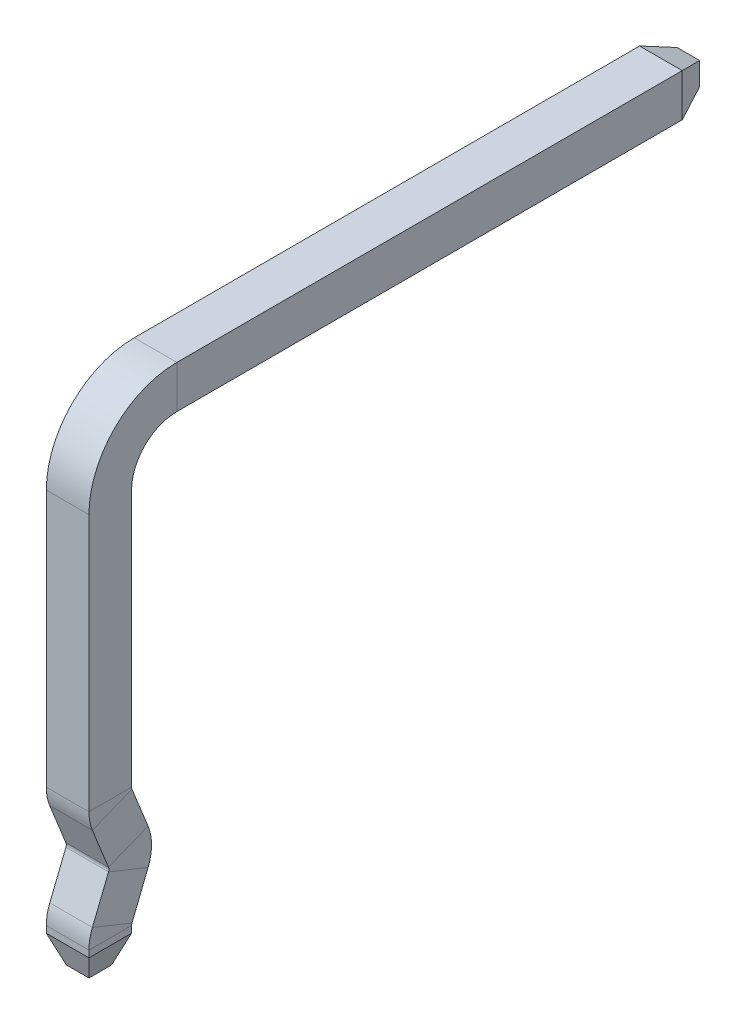
ISO-10303-21;
HEADER;
FILE_DESCRIPTION(('STEP AP214'),'2;1');
FILE_NAME('part.step','',(''),(''),'','','');
FILE_SCHEMA(('AUTOMOTIVE_DESIGN { 1 0 10303 214 1 1 1 1 }'));
ENDSEC;
DATA;
#1=APPLICATION_CONTEXT('core data for automotive mechanical design processes');
#2=APPLICATION_PROTOCOL_DEFINITION('international standard','automotive_design',2000,#1);
#3=PRODUCT_CONTEXT('',#1,'mechanical');
#4=PRODUCT('Part','Part','',(#3));
#5=PRODUCT_RELATED_PRODUCT_CATEGORY('part','',(#4));
#6=PRODUCT_DEFINITION_FORMATION('','',#4);
#7=PRODUCT_DEFINITION_CONTEXT('part definition',#1,'design');
#8=PRODUCT_DEFINITION('design','',#6,#7);
#9=PRODUCT_DEFINITION_SHAPE('','',#8);
#10=(LENGTH_UNIT() NAMED_UNIT(*) SI_UNIT(.MILLI.,.METRE.));
#11=(NAMED_UNIT(*) PLANE_ANGLE_UNIT() SI_UNIT($,.RADIAN.));
#12=(NAMED_UNIT(*) SI_UNIT($,.STERADIAN.) SOLID_ANGLE_UNIT());
#13=UNCERTAINTY_MEASURE_WITH_UNIT(LENGTH_MEASURE(1.E-05),#10,'distance_accuracy_value','');
#14=(GEOMETRIC_REPRESENTATION_CONTEXT(3) GLOBAL_UNCERTAINTY_ASSIGNED_CONTEXT((#13)) GLOBAL_UNIT_ASSIGNED_CONTEXT((#10,
#11,#12)) REPRESENTATION_CONTEXT('',''));
#15=CARTESIAN_POINT('',(0.,0.,0.));
#16=DIRECTION('',(0.,0.,1.));
#17=DIRECTION('',(1.,0.,0.));
#18=AXIS2_PLACEMENT_3D('',#15,#16,#17);
#19=CARTESIAN_POINT('',(5.32,-2.987878387082,3.13));
#20=DIRECTION('',(0.,-0.342020143325932,-0.939692620785813));
#21=DIRECTION('',(0.,-0.939692620785813,0.342020143325932));
#22=AXIS2_PLACEMENT_3D('',#19,#20,#21);
#23=PLANE('',#22);
#24=DIRECTION('',(0.323615577118036,0.889126490716097,-0.323615577118036));
#25=VECTOR('',#24,1.);
#26=CARTESIAN_POINT('',(5.32,-2.987878387082,3.13));
#27=LINE('',#26,#25);
#28=CARTESIAN_POINT('',(5.17,-3.4,3.28));
#29=VERTEX_POINT('',#28);
#30=CARTESIAN_POINT('',(5.32,-2.987878387082,3.13));
#31=VERTEX_POINT('',#30);
#32=EDGE_CURVE('E27',#29,#31,#27,.T.);
#33=ORIENTED_EDGE('',*,*,#32,.F.);
#34=DIRECTION('',(1.,0.,0.));
#35=VECTOR('',#34,1.);
#36=CARTESIAN_POINT('',(5.32,-3.4,3.28));
#37=LINE('',#36,#35);
#38=CARTESIAN_POINT('',(4.83,-3.4,3.28));
#39=VERTEX_POINT('',#38);
#40=EDGE_CURVE('E338',#39,#29,#37,.T.);
#41=ORIENTED_EDGE('',*,*,#40,.F.);
#42=DIRECTION('',(0.323615577118036,-0.889126490716097,0.323615577118036));
#43=VECTOR('',#42,1.);
#44=CARTESIAN_POINT('',(4.68,-2.987878387082,3.13));
#45=LINE('',#44,#43);
#46=CARTESIAN_POINT('',(4.68,-2.987878387082,3.13));
#47=VERTEX_POINT('',#46);
#48=EDGE_CURVE('E11',#47,#39,#45,.T.);
#49=ORIENTED_EDGE('',*,*,#48,.F.);
#50=DIRECTION('',(1.,0.,0.));
#51=VECTOR('',#50,1.);
#52=CARTESIAN_POINT('',(4.68,-2.987878387082,3.13));
#53=LINE('',#52,#51);
#54=EDGE_CURVE('E296',#47,#31,#53,.T.);
#55=ORIENTED_EDGE('',*,*,#54,.T.);
#56=EDGE_LOOP('',(#33,#41,#49,#55));
#57=FACE_BOUND('',#56,.T.);
#58=ADVANCED_FACE('F16',(#57),#23,.T.);
#59=CARTESIAN_POINT('',(4.68,-2.987878387082,3.13));
#60=DIRECTION('',(-0.939692620785813,-0.342020143325932,0.));
#61=DIRECTION('',(-0.342020143325932,0.939692620785813,0.));
#62=AXIS2_PLACEMENT_3D('',#59,#60,#61);
#63=PLANE('',#62);
#64=ORIENTED_EDGE('',*,*,#48,.T.);
#65=DIRECTION('',(0.,0.,-1.));
#66=VECTOR('',#65,1.);
#67=CARTESIAN_POINT('',(4.83,-3.4,3.13));
#68=LINE('',#67,#66);
#69=CARTESIAN_POINT('',(4.83,-3.4,3.62));
#70=VERTEX_POINT('',#69);
#71=EDGE_CURVE('E326',#70,#39,#68,.T.);
#72=ORIENTED_EDGE('',*,*,#71,.F.);
#73=DIRECTION('',(0.323615577118036,-0.889126490716097,-0.323615577118036));
#74=VECTOR('',#73,1.);
#75=CARTESIAN_POINT('',(4.747025306722,-3.172028903833,3.702974693278));
#76=LINE('',#75,#74);
#77=CARTESIAN_POINT('',(4.68,-2.987878387082,3.77));
#78=VERTEX_POINT('',#77);
#79=EDGE_CURVE('E342',#78,#70,#76,.T.);
#80=ORIENTED_EDGE('',*,*,#79,.F.);
#81=DIRECTION('',(0.,0.,-1.));
#82=VECTOR('',#81,1.);
#83=CARTESIAN_POINT('',(4.68,-2.987878387082,3.77));
#84=LINE('',#83,#82);
#85=EDGE_CURVE('E313',#78,#47,#84,.T.);
#86=ORIENTED_EDGE('',*,*,#85,.T.);
#87=EDGE_LOOP('',(#64,#72,#80,#86));
#88=FACE_BOUND('',#87,.T.);
#89=ADVANCED_FACE('F742',(#88),#63,.T.);
#90=CARTESIAN_POINT('',(5.32,-2.987878387082,3.77));
#91=DIRECTION('',(0.939692620785813,-0.342020143325932,0.));
#92=DIRECTION('',(0.,0.,-1.));
#93=AXIS2_PLACEMENT_3D('',#90,#91,#92);
#94=PLANE('',#93);
#95=ORIENTED_EDGE('',*,*,#32,.T.);
#96=DIRECTION('',(0.,0.,1.));
#97=VECTOR('',#96,1.);
#98=CARTESIAN_POINT('',(5.32,-2.987878387082,3.13));
#99=LINE('',#98,#97);
#100=CARTESIAN_POINT('',(5.32,-2.987878387082,3.77));
#101=VERTEX_POINT('',#100);
#102=EDGE_CURVE('E357',#31,#101,#99,.T.);
#103=ORIENTED_EDGE('',*,*,#102,.T.);
#104=DIRECTION('',(0.323615577118036,0.889126490716097,0.323615577118036));
#105=VECTOR('',#104,1.);
#106=CARTESIAN_POINT('',(5.32,-2.987878387082,3.77));
#107=LINE('',#106,#105);
#108=CARTESIAN_POINT('',(5.17,-3.4,3.62));
#109=VERTEX_POINT('',#108);
#110=EDGE_CURVE('E364',#109,#101,#107,.T.);
#111=ORIENTED_EDGE('',*,*,#110,.F.);
#112=DIRECTION('',(0.,0.,1.));
#113=VECTOR('',#112,1.);
#114=CARTESIAN_POINT('',(5.17,-3.4,3.77));
#115=LINE('',#114,#113);
#116=EDGE_CURVE('E327',#29,#109,#115,.T.);
#117=ORIENTED_EDGE('',*,*,#116,.F.);
#118=EDGE_LOOP('',(#95,#103,#111,#117));
#119=FACE_BOUND('',#118,.T.);
#120=ADVANCED_FACE('F747',(#119),#94,.T.);
#121=CARTESIAN_POINT('',(4.68,-2.987878387082,3.77));
#122=DIRECTION('',(0.,-0.342020143325932,0.939692620785813));
#123=DIRECTION('',(-1.,0.,0.));
#124=AXIS2_PLACEMENT_3D('',#121,#122,#123);
#125=PLANE('',#124);
#126=ORIENTED_EDGE('',*,*,#79,.T.);
#127=DIRECTION('',(-1.,0.,0.));
#128=VECTOR('',#127,1.);
#129=CARTESIAN_POINT('',(4.68,-3.4,3.62));
#130=LINE('',#129,#128);
#131=EDGE_CURVE('E322',#109,#70,#130,.T.);
#132=ORIENTED_EDGE('',*,*,#131,.F.);
#133=ORIENTED_EDGE('',*,*,#110,.T.);
#134=DIRECTION('',(-1.,0.,0.));
#135=VECTOR('',#134,1.);
#136=CARTESIAN_POINT('',(5.32,-2.987878387082,3.77));
#137=LINE('',#136,#135);
#138=EDGE_CURVE('E212',#101,#78,#137,.T.);
#139=ORIENTED_EDGE('',*,*,#138,.T.);
#140=EDGE_LOOP('',(#126,#132,#133,#139));
#141=FACE_BOUND('',#140,.T.);
#142=ADVANCED_FACE('F883',(#141),#125,.T.);
#143=CARTESIAN_POINT('',(0.,-3.4,-0.325));
#144=DIRECTION('',(0.,1.,0.));
#145=DIRECTION('',(0.,0.,-1.));
#146=AXIS2_PLACEMENT_3D('',#143,#144,#145);
#147=PLANE('',#146);
#148=ORIENTED_EDGE('',*,*,#116,.T.);
#149=ORIENTED_EDGE('',*,*,#131,.T.);
#150=ORIENTED_EDGE('',*,*,#71,.T.);
#151=ORIENTED_EDGE('',*,*,#40,.T.);
#152=EDGE_LOOP('',(#148,#149,#150,#151));
#153=FACE_BOUND('',#152,.T.);
#154=ADVANCED_FACE('F878',(#153),#147,.F.);
#155=CARTESIAN_POINT('',(5.32,2.775,3.77));
#156=DIRECTION('',(0.,0.,1.));
#157=DIRECTION('',(1.,0.,0.));
#158=AXIS2_PLACEMENT_3D('',#155,#156,#157);
#159=PLANE('',#158);
#160=DIRECTION('',(0.,-1.,0.));
#161=VECTOR('',#160,1.);
#162=CARTESIAN_POINT('',(4.68,2.775,3.77));
#163=LINE('',#162,#161);
#164=CARTESIAN_POINT('',(4.68,2.775,3.77));
#165=VERTEX_POINT('',#164);
#166=CARTESIAN_POINT('',(4.68,-1.087878387082,3.77));
#167=VERTEX_POINT('',#166);
#168=EDGE_CURVE('E402',#165,#167,#163,.T.);
#169=ORIENTED_EDGE('',*,*,#168,.T.);
#170=DIRECTION('',(-1.,0.,0.));
#171=VECTOR('',#170,1.);
#172=CARTESIAN_POINT('',(5.32,-1.087878387082,3.77));
#173=LINE('',#172,#171);
#174=CARTESIAN_POINT('',(5.32,-1.087878387082,3.77));
#175=VERTEX_POINT('',#174);
#176=EDGE_CURVE('E290',#175,#167,#173,.T.);
#177=ORIENTED_EDGE('',*,*,#176,.F.);
#178=DIRECTION('',(0.,-1.,0.));
#179=VECTOR('',#178,1.);
#180=CARTESIAN_POINT('',(5.32,2.775,3.77));
#181=LINE('',#180,#179);
#182=CARTESIAN_POINT('',(5.32,2.775,3.77));
#183=VERTEX_POINT('',#182);
#184=EDGE_CURVE('E306',#183,#175,#181,.T.);
#185=ORIENTED_EDGE('',*,*,#184,.F.);
#186=DIRECTION('',(1.,0.,0.));
#187=VECTOR('',#186,1.);
#188=CARTESIAN_POINT('',(4.68,2.775,3.77));
#189=LINE('',#188,#187);
#190=EDGE_CURVE('E232',#165,#183,#189,.T.);
#191=ORIENTED_EDGE('',*,*,#190,.F.);
#192=EDGE_LOOP('',(#169,#177,#185,#191));
#193=FACE_BOUND('',#192,.T.);
#194=ADVANCED_FACE('F650',(#193),#159,.T.);
#195=CARTESIAN_POINT('',(4.68,2.775,3.13));
#196=DIRECTION('',(0.,0.,-1.));
#197=DIRECTION('',(0.,-1.,0.));
#198=AXIS2_PLACEMENT_3D('',#195,#196,#197);
#199=PLANE('',#198);
#200=DIRECTION('',(1.,0.,0.));
#201=VECTOR('',#200,1.);
#202=CARTESIAN_POINT('',(4.68,-1.087878387082,3.13));
#203=LINE('',#202,#201);
#204=CARTESIAN_POINT('',(4.68,-1.087878387082,3.13));
#205=VERTEX_POINT('',#204);
#206=CARTESIAN_POINT('',(5.32,-1.087878387082,3.13));
#207=VERTEX_POINT('',#206);
#208=EDGE_CURVE('E307',#205,#207,#203,.T.);
#209=ORIENTED_EDGE('',*,*,#208,.F.);
#210=DIRECTION('',(0.,-1.,0.));
#211=VECTOR('',#210,1.);
#212=CARTESIAN_POINT('',(4.68,2.775,3.13));
#213=LINE('',#212,#211);
#214=CARTESIAN_POINT('',(4.68,2.775,3.13));
#215=VERTEX_POINT('',#214);
#216=EDGE_CURVE('E371',#215,#205,#213,.T.);
#217=ORIENTED_EDGE('',*,*,#216,.F.);
#218=DIRECTION('',(-1.,0.,0.));
#219=VECTOR('',#218,1.);
#220=CARTESIAN_POINT('',(5.32,2.775,3.13));
#221=LINE('',#220,#219);
#222=CARTESIAN_POINT('',(5.32,2.775,3.13));
#223=VERTEX_POINT('',#222);
#224=EDGE_CURVE('E221',#223,#215,#221,.T.);
#225=ORIENTED_EDGE('',*,*,#224,.F.);
#226=DIRECTION('',(0.,-1.,0.));
#227=VECTOR('',#226,1.);
#228=CARTESIAN_POINT('',(5.32,2.775,3.13));
#229=LINE('',#228,#227);
#230=EDGE_CURVE('E233',#223,#207,#229,.T.);
#231=ORIENTED_EDGE('',*,*,#230,.T.);
#232=EDGE_LOOP('',(#209,#217,#225,#231));
#233=FACE_BOUND('',#232,.T.);
#234=ADVANCED_FACE('F645',(#233),#199,.T.);
#235=CARTESIAN_POINT('',(5.32,-1.087878387082,3.13));
#236=DIRECTION('',(1.,0.,0.));
#237=DIRECTION('',(0.,1.,0.));
#238=AXIS2_PLACEMENT_3D('',#235,#236,#237);
#239=PLANE('',#238);
#240=CARTESIAN_POINT('',(5.32,-1.087878387082,3.05));
#241=DIRECTION('',(1.,0.,0.));
#242=DIRECTION('',(0.,0.,1.));
#243=AXIS2_PLACEMENT_3D('',#240,#241,#242);
#244=CIRCLE('',#243,0.72);
#245=CARTESIAN_POINT('',(5.32,-1.356834363362,3.717879242695));
#246=VERTEX_POINT('',#245);
#247=EDGE_CURVE('E286',#175,#246,#244,.T.);
#248=ORIENTED_EDGE('',*,*,#247,.T.);
#249=DIRECTION('',(0.,-0.373549967055956,0.927610059298892));
#250=VECTOR('',#249,1.);
#251=CARTESIAN_POINT('',(5.32,-1.117762384446,3.124208804744));
#252=LINE('',#251,#250);
#253=CARTESIAN_POINT('',(5.32,-1.117762384446,3.124208804744));
#254=VERTEX_POINT('',#253);
#255=EDGE_CURVE('E267',#254,#246,#252,.T.);
#256=ORIENTED_EDGE('',*,*,#255,.F.);
#257=CARTESIAN_POINT('',(5.32,-1.087878387082,3.05));
#258=DIRECTION('',(1.,0.,0.));
#259=DIRECTION('',(0.,0.,1.));
#260=AXIS2_PLACEMENT_3D('',#257,#258,#259);
#261=CIRCLE('',#260,0.08);
#262=EDGE_CURVE('E311',#207,#254,#261,.T.);
#263=ORIENTED_EDGE('',*,*,#262,.F.);
#264=DIRECTION('',(0.,0.,1.));
#265=VECTOR('',#264,1.);
#266=CARTESIAN_POINT('',(5.32,-1.087878387082,3.13));
#267=LINE('',#266,#265);
#268=EDGE_CURVE('E302',#207,#175,#267,.T.);
#269=ORIENTED_EDGE('',*,*,#268,.T.);
#270=EDGE_LOOP('',(#248,#256,#263,#269));
#271=FACE_BOUND('',#270,.T.);
#272=ADVANCED_FACE('F573',(#271),#239,.T.);
#273=CARTESIAN_POINT('',(4.68,-1.087878387082,3.05));
#274=DIRECTION('',(1.,0.,0.));
#275=DIRECTION('',(0.,0.,-1.));
#276=AXIS2_PLACEMENT_3D('',#273,#274,#275);
#277=CYLINDRICAL_SURFACE('',#276,0.72);
#278=CARTESIAN_POINT('',(4.68,-1.087878387082,3.05));
#279=DIRECTION('',(1.,0.,0.));
#280=DIRECTION('',(0.,0.,1.));
#281=AXIS2_PLACEMENT_3D('',#278,#279,#280);
#282=CIRCLE('',#281,0.72);
#283=CARTESIAN_POINT('',(4.68,-1.356834363362,3.717879242695));
#284=VERTEX_POINT('',#283);
#285=EDGE_CURVE('E291',#167,#284,#282,.T.);
#286=ORIENTED_EDGE('',*,*,#285,.T.);
#287=DIRECTION('',(-1.,0.,0.));
#288=VECTOR('',#287,1.);
#289=CARTESIAN_POINT('',(5.32,-1.356834363362,3.717879242695));
#290=LINE('',#289,#288);
#291=EDGE_CURVE('E255',#246,#284,#290,.T.);
#292=ORIENTED_EDGE('',*,*,#291,.F.);
#293=ORIENTED_EDGE('',*,*,#247,.F.);
#294=ORIENTED_EDGE('',*,*,#176,.T.);
#295=EDGE_LOOP('',(#286,#292,#293,#294));
#296=FACE_BOUND('',#295,.T.);
#297=ADVANCED_FACE('F661',(#296),#277,.T.);
#298=CARTESIAN_POINT('',(4.68,-1.087878387082,3.77));
#299=DIRECTION('',(-1.,0.,0.));
#300=DIRECTION('',(0.,0.,1.));
#301=AXIS2_PLACEMENT_3D('',#298,#299,#300);
#302=PLANE('',#301);
#303=CARTESIAN_POINT('',(4.68,-1.087878387082,3.05));
#304=DIRECTION('',(1.,0.,0.));
#305=DIRECTION('',(0.,0.,1.));
#306=AXIS2_PLACEMENT_3D('',#303,#304,#305);
#307=CIRCLE('',#306,0.08);
#308=CARTESIAN_POINT('',(4.68,-1.117762384446,3.124208804744));
#309=VERTEX_POINT('',#308);
#310=EDGE_CURVE('E312',#205,#309,#307,.T.);
#311=ORIENTED_EDGE('',*,*,#310,.T.);
#312=DIRECTION('',(0.,0.373549967055956,-0.927610059298892));
#313=VECTOR('',#312,1.);
#314=CARTESIAN_POINT('',(4.68,-1.356834363362,3.717879242695));
#315=LINE('',#314,#313);
#316=EDGE_CURVE('E256',#284,#309,#315,.T.);
#317=ORIENTED_EDGE('',*,*,#316,.F.);
#318=ORIENTED_EDGE('',*,*,#285,.F.);
#319=DIRECTION('',(0.,0.,-1.));
#320=VECTOR('',#319,1.);
#321=CARTESIAN_POINT('',(4.68,-1.087878387082,3.77));
#322=LINE('',#321,#320);
#323=EDGE_CURVE('E407',#167,#205,#322,.T.);
#324=ORIENTED_EDGE('',*,*,#323,.T.);
#325=EDGE_LOOP('',(#311,#317,#318,#324));
#326=FACE_BOUND('',#325,.T.);
#327=ADVANCED_FACE('F656',(#326),#302,.T.);
#328=CARTESIAN_POINT('',(4.68,-1.087878387082,3.05));
#329=DIRECTION('',(1.,0.,0.));
#330=DIRECTION('',(0.,0.,-1.));
#331=AXIS2_PLACEMENT_3D('',#328,#329,#330);
#332=CYLINDRICAL_SURFACE('',#331,0.08);
#333=DIRECTION('',(1.,0.,0.));
#334=VECTOR('',#333,1.);
#335=CARTESIAN_POINT('',(4.68,-1.117762384446,3.124208804744));
#336=LINE('',#335,#334);
#337=EDGE_CURVE('E295',#309,#254,#336,.T.);
#338=ORIENTED_EDGE('',*,*,#337,.F.);
#339=ORIENTED_EDGE('',*,*,#310,.F.);
#340=ORIENTED_EDGE('',*,*,#208,.T.);
#341=ORIENTED_EDGE('',*,*,#262,.T.);
#342=EDGE_LOOP('',(#338,#339,#340,#341));
#343=FACE_BOUND('',#342,.T.);
#344=ADVANCED_FACE('F568',(#343),#332,.F.);
#345=CARTESIAN_POINT('',(5.32,-1.117762384446,3.124208804744));
#346=DIRECTION('',(1.,0.,0.));
#347=DIRECTION('',(0.,1.,0.));
#348=AXIS2_PLACEMENT_3D('',#345,#346,#347);
#349=PLANE('',#348);
#350=DIRECTION('',(0.,-0.927610059298892,-0.373549967055956));
#351=VECTOR('',#350,1.);
#352=CARTESIAN_POINT('',(5.32,-1.356834363362,3.717879242695));
#353=LINE('',#352,#351);
#354=CARTESIAN_POINT('',(5.32,-1.957994389717,3.475791195256));
#355=VERTEX_POINT('',#354);
#356=EDGE_CURVE('E252',#246,#355,#353,.T.);
#357=ORIENTED_EDGE('',*,*,#356,.T.);
#358=DIRECTION('',(0.,-0.373549967055956,0.927610059298892));
#359=VECTOR('',#358,1.);
#360=CARTESIAN_POINT('',(5.32,-1.718922410801,2.882120757305));
#361=LINE('',#360,#359);
#362=CARTESIAN_POINT('',(5.32,-1.718922410801,2.882120757305));
#363=VERTEX_POINT('',#362);
#364=EDGE_CURVE('E251',#363,#355,#361,.T.);
#365=ORIENTED_EDGE('',*,*,#364,.F.);
#366=DIRECTION('',(0.,-0.927610059298892,-0.373549967055956));
#367=VECTOR('',#366,1.);
#368=CARTESIAN_POINT('',(5.32,-1.117762384446,3.124208804744));
#369=LINE('',#368,#367);
#370=EDGE_CURVE('E281',#254,#363,#369,.T.);
#371=ORIENTED_EDGE('',*,*,#370,.F.);
#372=ORIENTED_EDGE('',*,*,#255,.T.);
#373=EDGE_LOOP('',(#357,#365,#371,#372));
#374=FACE_BOUND('',#373,.T.);
#375=ADVANCED_FACE('F576',(#374),#349,.T.);
#376=CARTESIAN_POINT('',(5.32,-1.356834363362,3.717879242695));
#377=DIRECTION('',(0.,-0.373549967055956,0.927610059298892));
#378=DIRECTION('',(-1.,0.,0.));
#379=AXIS2_PLACEMENT_3D('',#376,#377,#378);
#380=PLANE('',#379);
#381=DIRECTION('',(0.,-0.927610059298892,-0.373549967055956));
#382=VECTOR('',#381,1.);
#383=CARTESIAN_POINT('',(4.68,-1.356834363362,3.717879242695));
#384=LINE('',#383,#382);
#385=CARTESIAN_POINT('',(4.68,-1.957994389717,3.475791195256));
#386=VERTEX_POINT('',#385);
#387=EDGE_CURVE('E270',#284,#386,#384,.T.);
#388=ORIENTED_EDGE('',*,*,#387,.T.);
#389=DIRECTION('',(-1.,0.,0.));
#390=VECTOR('',#389,1.);
#391=CARTESIAN_POINT('',(5.32,-1.957994389717,3.475791195256));
#392=LINE('',#391,#390);
#393=EDGE_CURVE('E194',#355,#386,#392,.T.);
#394=ORIENTED_EDGE('',*,*,#393,.F.);
#395=ORIENTED_EDGE('',*,*,#356,.F.);
#396=ORIENTED_EDGE('',*,*,#291,.T.);
#397=EDGE_LOOP('',(#388,#394,#395,#396));
#398=FACE_BOUND('',#397,.T.);
#399=ADVANCED_FACE('F594',(#398),#380,.T.);
#400=CARTESIAN_POINT('',(4.68,-1.356834363362,3.717879242695));
#401=DIRECTION('',(-1.,0.,0.));
#402=DIRECTION('',(0.,0.,1.));
#403=AXIS2_PLACEMENT_3D('',#400,#401,#402);
#404=PLANE('',#403);
#405=DIRECTION('',(0.,-0.927610059298892,-0.373549967055956));
#406=VECTOR('',#405,1.);
#407=CARTESIAN_POINT('',(4.68,-1.117762384446,3.124208804744));
#408=LINE('',#407,#406);
#409=CARTESIAN_POINT('',(4.68,-1.718922410801,2.882120757305));
#410=VERTEX_POINT('',#409);
#411=EDGE_CURVE('E363',#309,#410,#408,.T.);
#412=ORIENTED_EDGE('',*,*,#411,.T.);
#413=DIRECTION('',(0.,0.373549967055956,-0.927610059298892));
#414=VECTOR('',#413,1.);
#415=CARTESIAN_POINT('',(4.68,-1.957994389717,3.475791195256));
#416=LINE('',#415,#414);
#417=EDGE_CURVE('E195',#386,#410,#416,.T.);
#418=ORIENTED_EDGE('',*,*,#417,.F.);
#419=ORIENTED_EDGE('',*,*,#387,.F.);
#420=ORIENTED_EDGE('',*,*,#316,.T.);
#421=EDGE_LOOP('',(#412,#418,#419,#420));
#422=FACE_BOUND('',#421,.T.);
#423=ADVANCED_FACE('F582',(#422),#404,.T.);
#424=CARTESIAN_POINT('',(4.68,-1.117762384446,3.124208804744));
#425=DIRECTION('',(0.,0.373549967055956,-0.927610059298892));
#426=DIRECTION('',(-1.,0.,0.));
#427=AXIS2_PLACEMENT_3D('',#424,#425,#426);
#428=PLANE('',#427);
#429=DIRECTION('',(1.,0.,0.));
#430=VECTOR('',#429,1.);
#431=CARTESIAN_POINT('',(4.68,-1.718922410801,2.882120757305));
#432=LINE('',#431,#430);
#433=EDGE_CURVE('E228',#410,#363,#432,.T.);
#434=ORIENTED_EDGE('',*,*,#433,.F.);
#435=ORIENTED_EDGE('',*,*,#411,.F.);
#436=ORIENTED_EDGE('',*,*,#337,.T.);
#437=ORIENTED_EDGE('',*,*,#370,.T.);
#438=EDGE_LOOP('',(#434,#435,#436,#437));
#439=FACE_BOUND('',#438,.T.);
#440=ADVANCED_FACE('F579',(#439),#428,.T.);
#441=CARTESIAN_POINT('',(5.32,-1.718922410801,2.882120757305));
#442=DIRECTION('',(1.,0.,0.));
#443=DIRECTION('',(0.,1.,0.));
#444=AXIS2_PLACEMENT_3D('',#441,#442,#443);
#445=PLANE('',#444);
#446=CARTESIAN_POINT('',(5.32,-1.987878387082,3.55));
#447=DIRECTION('',(-1.,0.,0.));
#448=DIRECTION('',(0.,0.373549967055956,-0.927610059298892));
#449=AXIS2_PLACEMENT_3D('',#446,#447,#448);
#450=CIRCLE('',#449,0.08);
#451=CARTESIAN_POINT('',(5.32,-2.017762384446,3.475791195256));
#452=VERTEX_POINT('',#451);
#453=EDGE_CURVE('E190',#355,#452,#450,.T.);
#454=ORIENTED_EDGE('',*,*,#453,.T.);
#455=DIRECTION('',(0.,0.373549967055956,0.927610059298892));
#456=VECTOR('',#455,1.);
#457=CARTESIAN_POINT('',(5.32,-2.256834363362,2.882120757305));
#458=LINE('',#457,#456);
#459=CARTESIAN_POINT('',(5.32,-2.256834363362,2.882120757305));
#460=VERTEX_POINT('',#459);
#461=EDGE_CURVE('E133',#460,#452,#458,.T.);
#462=ORIENTED_EDGE('',*,*,#461,.F.);
#463=CARTESIAN_POINT('',(5.32,-1.987878387082,3.55));
#464=DIRECTION('',(-1.,0.,0.));
#465=DIRECTION('',(0.,0.373549967055956,-0.927610059298892));
#466=AXIS2_PLACEMENT_3D('',#463,#464,#465);
#467=CIRCLE('',#466,0.72);
#468=EDGE_CURVE('E317',#363,#460,#467,.T.);
#469=ORIENTED_EDGE('',*,*,#468,.F.);
#470=ORIENTED_EDGE('',*,*,#364,.T.);
#471=EDGE_LOOP('',(#454,#462,#469,#470));
#472=FACE_BOUND('',#471,.T.);
#473=ADVANCED_FACE('F684',(#472),#445,.T.);
#474=CARTESIAN_POINT('',(4.68,-1.987878387082,3.55));
#475=DIRECTION('',(-1.,0.,0.));
#476=DIRECTION('',(0.,0.,1.));
#477=AXIS2_PLACEMENT_3D('',#474,#475,#476);
#478=CYLINDRICAL_SURFACE('',#477,0.08);
#479=CARTESIAN_POINT('',(4.68,-1.987878387082,3.55));
#480=DIRECTION('',(-1.,0.,0.));
#481=DIRECTION('',(0.,0.373549967055956,-0.927610059298892));
#482=AXIS2_PLACEMENT_3D('',#479,#480,#481);
#483=CIRCLE('',#482,0.08);
#484=CARTESIAN_POINT('',(4.68,-2.017762384446,3.475791195256));
#485=VERTEX_POINT('',#484);
#486=EDGE_CURVE('E320',#386,#485,#483,.T.);
#487=ORIENTED_EDGE('',*,*,#486,.T.);
#488=DIRECTION('',(-1.,0.,0.));
#489=VECTOR('',#488,1.);
#490=CARTESIAN_POINT('',(5.32,-2.017762384446,3.475791195256));
#491=LINE('',#490,#489);
#492=EDGE_CURVE('E139',#452,#485,#491,.T.);
#493=ORIENTED_EDGE('',*,*,#492,.F.);
#494=ORIENTED_EDGE('',*,*,#453,.F.);
#495=ORIENTED_EDGE('',*,*,#393,.T.);
#496=EDGE_LOOP('',(#487,#493,#494,#495));
#497=FACE_BOUND('',#496,.T.);
#498=ADVANCED_FACE('F590',(#497),#478,.F.);
#499=CARTESIAN_POINT('',(4.68,-1.957994389717,3.475791195256));
#500=DIRECTION('',(-1.,0.,0.));
#501=DIRECTION('',(0.,0.,1.));
#502=AXIS2_PLACEMENT_3D('',#499,#500,#501);
#503=PLANE('',#502);
#504=CARTESIAN_POINT('',(4.68,-1.987878387082,3.55));
#505=DIRECTION('',(-1.,0.,0.));
#506=DIRECTION('',(0.,0.373549967055956,-0.927610059298892));
#507=AXIS2_PLACEMENT_3D('',#504,#505,#506);
#508=CIRCLE('',#507,0.72);
#509=CARTESIAN_POINT('',(4.68,-2.256834363362,2.882120757305));
#510=VERTEX_POINT('',#509);
#511=EDGE_CURVE('E225',#410,#510,#508,.T.);
#512=ORIENTED_EDGE('',*,*,#511,.T.);
#513=DIRECTION('',(0.,-0.373549967055956,-0.927610059298892));
#514=VECTOR('',#513,1.);
#515=CARTESIAN_POINT('',(4.68,-2.017762384446,3.475791195256));
#516=LINE('',#515,#514);
#517=EDGE_CURVE('E140',#485,#510,#516,.T.);
#518=ORIENTED_EDGE('',*,*,#517,.F.);
#519=ORIENTED_EDGE('',*,*,#486,.F.);
#520=ORIENTED_EDGE('',*,*,#417,.T.);
#521=EDGE_LOOP('',(#512,#518,#519,#520));
#522=FACE_BOUND('',#521,.T.);
#523=ADVANCED_FACE('F587',(#522),#503,.T.);
#524=CARTESIAN_POINT('',(4.68,-1.987878387082,3.55));
#525=DIRECTION('',(-1.,0.,0.));
#526=DIRECTION('',(0.,0.,1.));
#527=AXIS2_PLACEMENT_3D('',#524,#525,#526);
#528=CYLINDRICAL_SURFACE('',#527,0.72);
#529=DIRECTION('',(1.,0.,0.));
#530=VECTOR('',#529,1.);
#531=CARTESIAN_POINT('',(4.68,-2.256834363362,2.882120757305));
#532=LINE('',#531,#530);
#533=EDGE_CURVE('E382',#510,#460,#532,.T.);
#534=ORIENTED_EDGE('',*,*,#533,.F.);
#535=ORIENTED_EDGE('',*,*,#511,.F.);
#536=ORIENTED_EDGE('',*,*,#433,.T.);
#537=ORIENTED_EDGE('',*,*,#468,.T.);
#538=EDGE_LOOP('',(#534,#535,#536,#537));
#539=FACE_BOUND('',#538,.T.);
#540=ADVANCED_FACE('F737',(#539),#528,.T.);
#541=CARTESIAN_POINT('',(5.32,-2.256834363362,2.882120757305));
#542=DIRECTION('',(1.,0.,0.));
#543=DIRECTION('',(0.,1.,0.));
#544=AXIS2_PLACEMENT_3D('',#541,#542,#543);
#545=PLANE('',#544);
#546=DIRECTION('',(0.,-0.927610059298892,0.373549967055956));
#547=VECTOR('',#546,1.);
#548=CARTESIAN_POINT('',(5.32,-2.017762384446,3.475791195256));
#549=LINE('',#548,#547);
#550=CARTESIAN_POINT('',(5.32,-2.618922410801,3.717879242695));
#551=VERTEX_POINT('',#550);
#552=EDGE_CURVE('E126',#452,#551,#549,.T.);
#553=ORIENTED_EDGE('',*,*,#552,.T.);
#554=DIRECTION('',(0.,0.373549967055956,0.927610059298892));
#555=VECTOR('',#554,1.);
#556=CARTESIAN_POINT('',(5.32,-2.857994389717,3.124208804744));
#557=LINE('',#556,#555);
#558=CARTESIAN_POINT('',(5.32,-2.857994389717,3.124208804744));
#559=VERTEX_POINT('',#558);
#560=EDGE_CURVE('E130',#559,#551,#557,.T.);
#561=ORIENTED_EDGE('',*,*,#560,.F.);
#562=DIRECTION('',(0.,-0.927610059298892,0.373549967055956));
#563=VECTOR('',#562,1.);
#564=CARTESIAN_POINT('',(5.32,-2.256834363362,2.882120757305));
#565=LINE('',#564,#563);
#566=EDGE_CURVE('E216',#460,#559,#565,.T.);
#567=ORIENTED_EDGE('',*,*,#566,.F.);
#568=ORIENTED_EDGE('',*,*,#461,.T.);
#569=EDGE_LOOP('',(#553,#561,#567,#568));
#570=FACE_BOUND('',#569,.T.);
#571=ADVANCED_FACE('F128',(#570),#545,.T.);
#572=CARTESIAN_POINT('',(5.32,-2.017762384446,3.475791195256));
#573=DIRECTION('',(0.,0.373549967055956,0.927610059298892));
#574=DIRECTION('',(1.,0.,0.));
#575=AXIS2_PLACEMENT_3D('',#572,#573,#574);
#576=PLANE('',#575);
#577=DIRECTION('',(0.,-0.927610059298892,0.373549967055956));
#578=VECTOR('',#577,1.);
#579=CARTESIAN_POINT('',(4.68,-2.017762384446,3.475791195256));
#580=LINE('',#579,#578);
#581=CARTESIAN_POINT('',(4.68,-2.618922410801,3.717879242695));
#582=VERTEX_POINT('',#581);
#583=EDGE_CURVE('E160',#485,#582,#580,.T.);
#584=ORIENTED_EDGE('',*,*,#583,.T.);
#585=DIRECTION('',(-1.,0.,0.));
#586=VECTOR('',#585,1.);
#587=CARTESIAN_POINT('',(5.32,-2.618922410801,3.717879242695));
#588=LINE('',#587,#586);
#589=EDGE_CURVE('E155',#551,#582,#588,.T.);
#590=ORIENTED_EDGE('',*,*,#589,.F.);
#591=ORIENTED_EDGE('',*,*,#552,.F.);
#592=ORIENTED_EDGE('',*,*,#492,.T.);
#593=EDGE_LOOP('',(#584,#590,#591,#592));
#594=FACE_BOUND('',#593,.T.);
#595=ADVANCED_FACE('F158',(#594),#576,.T.);
#596=CARTESIAN_POINT('',(4.68,-2.017762384446,3.475791195256));
#597=DIRECTION('',(-1.,0.,0.));
#598=DIRECTION('',(0.,0.,1.));
#599=AXIS2_PLACEMENT_3D('',#596,#597,#598);
#600=PLANE('',#599);
#601=DIRECTION('',(0.,-0.927610059298892,0.373549967055956));
#602=VECTOR('',#601,1.);
#603=CARTESIAN_POINT('',(4.68,-2.256834363362,2.882120757305));
#604=LINE('',#603,#602);
#605=CARTESIAN_POINT('',(4.68,-2.857994389717,3.124208804744));
#606=VERTEX_POINT('',#605);
#607=EDGE_CURVE('E154',#510,#606,#604,.T.);
#608=ORIENTED_EDGE('',*,*,#607,.T.);
#609=DIRECTION('',(0.,-0.373549967055956,-0.927610059298892));
#610=VECTOR('',#609,1.);
#611=CARTESIAN_POINT('',(4.68,-2.618922410801,3.717879242695));
#612=LINE('',#611,#610);
#613=EDGE_CURVE('E20',#582,#606,#612,.T.);
#614=ORIENTED_EDGE('',*,*,#613,.F.);
#615=ORIENTED_EDGE('',*,*,#583,.F.);
#616=ORIENTED_EDGE('',*,*,#517,.T.);
#617=EDGE_LOOP('',(#608,#614,#615,#616));
#618=FACE_BOUND('',#617,.T.);
#619=ADVANCED_FACE('F714',(#618),#600,.T.);
#620=CARTESIAN_POINT('',(4.68,-2.256834363362,2.882120757305));
#621=DIRECTION('',(0.,-0.373549967055956,-0.927610059298892));
#622=DIRECTION('',(0.,-0.927610059298892,0.373549967055956));
#623=AXIS2_PLACEMENT_3D('',#620,#621,#622);
#624=PLANE('',#623);
#625=DIRECTION('',(1.,0.,0.));
#626=VECTOR('',#625,1.);
#627=CARTESIAN_POINT('',(4.68,-2.857994389717,3.124208804744));
#628=LINE('',#627,#626);
#629=EDGE_CURVE('E186',#606,#559,#628,.T.);
#630=ORIENTED_EDGE('',*,*,#629,.F.);
#631=ORIENTED_EDGE('',*,*,#607,.F.);
#632=ORIENTED_EDGE('',*,*,#533,.T.);
#633=ORIENTED_EDGE('',*,*,#566,.T.);
#634=EDGE_LOOP('',(#630,#631,#632,#633));
#635=FACE_BOUND('',#634,.T.);
#636=ADVANCED_FACE('F507',(#635),#624,.T.);
#637=CARTESIAN_POINT('',(5.32,-2.857994389717,3.124208804744));
#638=DIRECTION('',(1.,0.,0.));
#639=DIRECTION('',(0.,1.,0.));
#640=AXIS2_PLACEMENT_3D('',#637,#638,#639);
#641=PLANE('',#640);
#642=CARTESIAN_POINT('',(5.32,-2.887878387082,3.05));
#643=DIRECTION('',(1.,0.,0.));
#644=DIRECTION('',(0.,0.373549967055956,0.927610059298892));
#645=AXIS2_PLACEMENT_3D('',#642,#643,#644);
#646=CIRCLE('',#645,0.72);
#647=CARTESIAN_POINT('',(5.32,-2.887878387082,3.77));
#648=VERTEX_POINT('',#647);
#649=EDGE_CURVE('E148',#551,#648,#646,.T.);
#650=ORIENTED_EDGE('',*,*,#649,.T.);
#651=DIRECTION('',(0.,0.,1.));
#652=VECTOR('',#651,1.);
#653=CARTESIAN_POINT('',(5.32,-2.887878387082,3.13));
#654=LINE('',#653,#652);
#655=CARTESIAN_POINT('',(5.32,-2.887878387082,3.13));
#656=VERTEX_POINT('',#655);
#657=EDGE_CURVE('E187',#656,#648,#654,.T.);
#658=ORIENTED_EDGE('',*,*,#657,.F.);
#659=CARTESIAN_POINT('',(5.32,-2.887878387082,3.05));
#660=DIRECTION('',(1.,0.,0.));
#661=DIRECTION('',(0.,0.373549967055956,0.927610059298892));
#662=AXIS2_PLACEMENT_3D('',#659,#660,#661);
#663=CIRCLE('',#662,0.08);
#664=EDGE_CURVE('E151',#559,#656,#663,.T.);
#665=ORIENTED_EDGE('',*,*,#664,.F.);
#666=ORIENTED_EDGE('',*,*,#560,.T.);
#667=EDGE_LOOP('',(#650,#658,#665,#666));
#668=FACE_BOUND('',#667,.T.);
#669=ADVANCED_FACE('F144',(#668),#641,.T.);
#670=CARTESIAN_POINT('',(4.68,-2.887878387082,3.05));
#671=DIRECTION('',(1.,0.,0.));
#672=DIRECTION('',(0.,0.,-1.));
#673=AXIS2_PLACEMENT_3D('',#670,#671,#672);
#674=CYLINDRICAL_SURFACE('',#673,0.72);
#675=CARTESIAN_POINT('',(4.68,-2.887878387082,3.05));
#676=DIRECTION('',(1.,0.,0.));
#677=DIRECTION('',(0.,0.373549967055956,0.927610059298892));
#678=AXIS2_PLACEMENT_3D('',#675,#676,#677);
#679=CIRCLE('',#678,0.72);
#680=CARTESIAN_POINT('',(4.68,-2.887878387082,3.77));
#681=VERTEX_POINT('',#680);
#682=EDGE_CURVE('E177',#582,#681,#679,.T.);
#683=ORIENTED_EDGE('',*,*,#682,.T.);
#684=DIRECTION('',(-1.,0.,0.));
#685=VECTOR('',#684,1.);
#686=CARTESIAN_POINT('',(5.32,-2.887878387082,3.77));
#687=LINE('',#686,#685);
#688=EDGE_CURVE('E168',#648,#681,#687,.T.);
#689=ORIENTED_EDGE('',*,*,#688,.F.);
#690=ORIENTED_EDGE('',*,*,#649,.F.);
#691=ORIENTED_EDGE('',*,*,#589,.T.);
#692=EDGE_LOOP('',(#683,#689,#690,#691));
#693=FACE_BOUND('',#692,.T.);
#694=ADVANCED_FACE('F18',(#693),#674,.T.);
#695=CARTESIAN_POINT('',(4.68,-2.618922410801,3.717879242695));
#696=DIRECTION('',(-1.,0.,0.));
#697=DIRECTION('',(0.,0.,1.));
#698=AXIS2_PLACEMENT_3D('',#695,#696,#697);
#699=PLANE('',#698);
#700=CARTESIAN_POINT('',(4.68,-2.887878387082,3.05));
#701=DIRECTION('',(1.,0.,0.));
#702=DIRECTION('',(0.,0.373549967055956,0.927610059298892));
#703=AXIS2_PLACEMENT_3D('',#700,#701,#702);
#704=CIRCLE('',#703,0.08);
#705=CARTESIAN_POINT('',(4.68,-2.887878387082,3.13));
#706=VERTEX_POINT('',#705);
#707=EDGE_CURVE('E182',#606,#706,#704,.T.);
#708=ORIENTED_EDGE('',*,*,#707,.T.);
#709=DIRECTION('',(0.,0.,-1.));
#710=VECTOR('',#709,1.);
#711=CARTESIAN_POINT('',(4.68,-2.887878387082,3.77));
#712=LINE('',#711,#710);
#713=EDGE_CURVE('E208',#681,#706,#712,.T.);
#714=ORIENTED_EDGE('',*,*,#713,.F.);
#715=ORIENTED_EDGE('',*,*,#682,.F.);
#716=ORIENTED_EDGE('',*,*,#613,.T.);
#717=EDGE_LOOP('',(#708,#714,#715,#716));
#718=FACE_BOUND('',#717,.T.);
#719=ADVANCED_FACE('F640',(#718),#699,.T.);
#720=CARTESIAN_POINT('',(4.68,-2.887878387082,3.05));
#721=DIRECTION('',(1.,0.,0.));
#722=DIRECTION('',(0.,0.,-1.));
#723=AXIS2_PLACEMENT_3D('',#720,#721,#722);
#724=CYLINDRICAL_SURFACE('',#723,0.08);
#725=DIRECTION('',(1.,0.,0.));
#726=VECTOR('',#725,1.);
#727=CARTESIAN_POINT('',(4.68,-2.887878387082,3.13));
#728=LINE('',#727,#726);
#729=EDGE_CURVE('E401',#706,#656,#728,.T.);
#730=ORIENTED_EDGE('',*,*,#729,.F.);
#731=ORIENTED_EDGE('',*,*,#707,.F.);
#732=ORIENTED_EDGE('',*,*,#629,.T.);
#733=ORIENTED_EDGE('',*,*,#664,.T.);
#734=EDGE_LOOP('',(#730,#731,#732,#733));
#735=FACE_BOUND('',#734,.T.);
#736=ADVANCED_FACE('F792',(#735),#724,.F.);
#737=CARTESIAN_POINT('',(5.32,-2.887878387082,3.13));
#738=DIRECTION('',(1.,0.,0.));
#739=DIRECTION('',(0.,1.,0.));
#740=AXIS2_PLACEMENT_3D('',#737,#738,#739);
#741=PLANE('',#740);
#742=DIRECTION('',(0.,-1.,0.));
#743=VECTOR('',#742,1.);
#744=CARTESIAN_POINT('',(5.32,-2.887878387082,3.77));
#745=LINE('',#744,#743);
#746=EDGE_CURVE('E378',#648,#101,#745,.T.);
#747=ORIENTED_EDGE('',*,*,#746,.T.);
#748=ORIENTED_EDGE('',*,*,#102,.F.);
#749=DIRECTION('',(0.,-1.,0.));
#750=VECTOR('',#749,1.);
#751=CARTESIAN_POINT('',(5.32,-2.887878387082,3.13));
#752=LINE('',#751,#750);
#753=EDGE_CURVE('E316',#656,#31,#752,.T.);
#754=ORIENTED_EDGE('',*,*,#753,.F.);
#755=ORIENTED_EDGE('',*,*,#657,.T.);
#756=EDGE_LOOP('',(#747,#748,#754,#755));
#757=FACE_BOUND('',#756,.T.);
#758=ADVANCED_FACE('F786',(#757),#741,.T.);
#759=CARTESIAN_POINT('',(5.32,-2.887878387082,3.77));
#760=DIRECTION('',(0.,0.,1.));
#761=DIRECTION('',(1.,0.,0.));
#762=AXIS2_PLACEMENT_3D('',#759,#760,#761);
#763=PLANE('',#762);
#764=DIRECTION('',(0.,-1.,0.));
#765=VECTOR('',#764,1.);
#766=CARTESIAN_POINT('',(4.68,-2.887878387082,3.77));
#767=LINE('',#766,#765);
#768=EDGE_CURVE('E213',#681,#78,#767,.T.);
#769=ORIENTED_EDGE('',*,*,#768,.T.);
#770=ORIENTED_EDGE('',*,*,#138,.F.);
#771=ORIENTED_EDGE('',*,*,#746,.F.);
#772=ORIENTED_EDGE('',*,*,#688,.T.);
#773=EDGE_LOOP('',(#769,#770,#771,#772));
#774=FACE_BOUND('',#773,.T.);
#775=ADVANCED_FACE('F791',(#774),#763,.T.);
#776=CARTESIAN_POINT('',(4.68,-2.887878387082,3.77));
#777=DIRECTION('',(-1.,0.,0.));
#778=DIRECTION('',(0.,0.,1.));
#779=AXIS2_PLACEMENT_3D('',#776,#777,#778);
#780=PLANE('',#779);
#781=DIRECTION('',(0.,-1.,0.));
#782=VECTOR('',#781,1.);
#783=CARTESIAN_POINT('',(4.68,-2.887878387082,3.13));
#784=LINE('',#783,#782);
#785=EDGE_CURVE('E300',#706,#47,#784,.T.);
#786=ORIENTED_EDGE('',*,*,#785,.T.);
#787=ORIENTED_EDGE('',*,*,#85,.F.);
#788=ORIENTED_EDGE('',*,*,#768,.F.);
#789=ORIENTED_EDGE('',*,*,#713,.T.);
#790=EDGE_LOOP('',(#786,#787,#788,#789));
#791=FACE_BOUND('',#790,.T.);
#792=ADVANCED_FACE('F696',(#791),#780,.T.);
#793=CARTESIAN_POINT('',(4.68,-2.887878387082,3.13));
#794=DIRECTION('',(0.,0.,-1.));
#795=DIRECTION('',(0.,-1.,0.));
#796=AXIS2_PLACEMENT_3D('',#793,#794,#795);
#797=PLANE('',#796);
#798=ORIENTED_EDGE('',*,*,#54,.F.);
#799=ORIENTED_EDGE('',*,*,#785,.F.);
#800=ORIENTED_EDGE('',*,*,#729,.T.);
#801=ORIENTED_EDGE('',*,*,#753,.T.);
#802=EDGE_LOOP('',(#798,#799,#800,#801));
#803=FACE_BOUND('',#802,.T.);
#804=ADVANCED_FACE('F690',(#803),#797,.T.);
#805=CARTESIAN_POINT('',(0.,3.605,-5.55));
#806=DIRECTION('',(0.,0.939692620785813,0.342020143325932));
#807=DIRECTION('',(1.,0.,0.));
#808=AXIS2_PLACEMENT_3D('',#805,#806,#807);
#809=PLANE('',#808);
#810=DIRECTION('',(0.323615577118036,-0.323615577118036,0.889126490716097));
#811=VECTOR('',#810,1.);
#812=CARTESIAN_POINT('',(5.547540985522,3.227459014479,-4.512714667361));
#813=LINE('',#812,#811);
#814=CARTESIAN_POINT('',(5.17,3.605,-5.55));
#815=VERTEX_POINT('',#814);
#816=CARTESIAN_POINT('',(5.32,3.455,-5.137878387082));
#817=VERTEX_POINT('',#816);
#818=EDGE_CURVE('E348',#815,#817,#813,.T.);
#819=ORIENTED_EDGE('',*,*,#818,.T.);
#820=DIRECTION('',(1.,0.,0.));
#821=VECTOR('',#820,1.);
#822=CARTESIAN_POINT('',(5.32,3.455,-5.137878387082));
#823=LINE('',#822,#821);
#824=CARTESIAN_POINT('',(4.68,3.455,-5.137878387082));
#825=VERTEX_POINT('',#824);
#826=EDGE_CURVE('E337',#825,#817,#823,.T.);
#827=ORIENTED_EDGE('',*,*,#826,.F.);
#828=DIRECTION('',(0.323615577118036,0.323615577118036,-0.889126490716097));
#829=VECTOR('',#828,1.);
#830=CARTESIAN_POINT('',(4.452459014478,3.227459014479,-4.512714667361));
#831=LINE('',#830,#829);
#832=CARTESIAN_POINT('',(4.83,3.605,-5.55));
#833=VERTEX_POINT('',#832);
#834=EDGE_CURVE('E301',#825,#833,#831,.T.);
#835=ORIENTED_EDGE('',*,*,#834,.T.);
#836=DIRECTION('',(-1.,0.,0.));
#837=VECTOR('',#836,1.);
#838=CARTESIAN_POINT('',(0.,3.605,-5.55));
#839=LINE('',#838,#837);
#840=EDGE_CURVE('E180',#815,#833,#839,.T.);
#841=ORIENTED_EDGE('',*,*,#840,.F.);
#842=EDGE_LOOP('',(#819,#827,#835,#841));
#843=FACE_BOUND('',#842,.T.);
#844=ADVANCED_FACE('F695',(#843),#809,.F.);
#845=CARTESIAN_POINT('',(4.83,0.,-5.55));
#846=DIRECTION('',(0.939692620785813,0.,0.342020143325932));
#847=DIRECTION('',(0.,-1.,0.));
#848=AXIS2_PLACEMENT_3D('',#845,#846,#847);
#849=PLANE('',#848);
#850=DIRECTION('',(0.323615577118036,-0.323615577118036,-0.889126490716097));
#851=VECTOR('',#850,1.);
#852=CARTESIAN_POINT('',(5.243148179718,3.531851820282,-6.685115294663));
#853=LINE('',#852,#851);
#854=CARTESIAN_POINT('',(4.68,4.095,-5.137878387082));
#855=VERTEX_POINT('',#854);
#856=CARTESIAN_POINT('',(4.83,3.945,-5.55));
#857=VERTEX_POINT('',#856);
#858=EDGE_CURVE('E202',#855,#857,#853,.T.);
#859=ORIENTED_EDGE('',*,*,#858,.T.);
#860=DIRECTION('',(0.,1.,0.));
#861=VECTOR('',#860,1.);
#862=CARTESIAN_POINT('',(4.83,0.,-5.55));
#863=LINE('',#862,#861);
#864=EDGE_CURVE('E237',#833,#857,#863,.T.);
#865=ORIENTED_EDGE('',*,*,#864,.F.);
#866=ORIENTED_EDGE('',*,*,#834,.F.);
#867=DIRECTION('',(0.,-1.,0.));
#868=VECTOR('',#867,1.);
#869=CARTESIAN_POINT('',(4.68,3.455,-5.137878387082));
#870=LINE('',#869,#868);
#871=EDGE_CURVE('E419',#855,#825,#870,.T.);
#872=ORIENTED_EDGE('',*,*,#871,.F.);
#873=EDGE_LOOP('',(#859,#865,#866,#872));
#874=FACE_BOUND('',#873,.T.);
#875=ADVANCED_FACE('F899',(#874),#849,.F.);
#876=CARTESIAN_POINT('',(5.17,0.,-5.55));
#877=DIRECTION('',(-0.939692620785813,0.,0.342020143325932));
#878=DIRECTION('',(0.,1.,0.));
#879=AXIS2_PLACEMENT_3D('',#876,#877,#878);
#880=PLANE('',#879);
#881=DIRECTION('',(0.323615577118036,0.323615577118036,0.889126490716097));
#882=VECTOR('',#881,1.);
#883=CARTESIAN_POINT('',(4.628561194134,3.403561194134,-7.037590893133));
#884=LINE('',#883,#882);
#885=CARTESIAN_POINT('',(5.17,3.945,-5.55));
#886=VERTEX_POINT('',#885);
#887=CARTESIAN_POINT('',(5.32,4.095,-5.137878387082));
#888=VERTEX_POINT('',#887);
#889=EDGE_CURVE('E206',#886,#888,#884,.T.);
#890=ORIENTED_EDGE('',*,*,#889,.T.);
#891=DIRECTION('',(0.,1.,0.));
#892=VECTOR('',#891,1.);
#893=CARTESIAN_POINT('',(5.32,4.095,-5.137878387082));
#894=LINE('',#893,#892);
#895=EDGE_CURVE('E200',#817,#888,#894,.T.);
#896=ORIENTED_EDGE('',*,*,#895,.F.);
#897=ORIENTED_EDGE('',*,*,#818,.F.);
#898=DIRECTION('',(0.,-1.,0.));
#899=VECTOR('',#898,1.);
#900=CARTESIAN_POINT('',(5.17,0.,-5.55));
#901=LINE('',#900,#899);
#902=EDGE_CURVE('E406',#886,#815,#901,.T.);
#903=ORIENTED_EDGE('',*,*,#902,.F.);
#904=EDGE_LOOP('',(#890,#896,#897,#903));
#905=FACE_BOUND('',#904,.T.);
#906=ADVANCED_FACE('F833',(#905),#880,.F.);
#907=CARTESIAN_POINT('',(0.,3.945,-5.55));
#908=DIRECTION('',(0.,-0.939692620785813,0.342020143325932));
#909=DIRECTION('',(-1.,0.,0.));
#910=AXIS2_PLACEMENT_3D('',#907,#908,#909);
#911=PLANE('',#910);
#912=ORIENTED_EDGE('',*,*,#858,.F.);
#913=DIRECTION('',(-1.,0.,0.));
#914=VECTOR('',#913,1.);
#915=CARTESIAN_POINT('',(4.68,4.095,-5.137878387082));
#916=LINE('',#915,#914);
#917=EDGE_CURVE('E238',#888,#855,#916,.T.);
#918=ORIENTED_EDGE('',*,*,#917,.F.);
#919=ORIENTED_EDGE('',*,*,#889,.F.);
#920=DIRECTION('',(1.,0.,0.));
#921=VECTOR('',#920,1.);
#922=CARTESIAN_POINT('',(0.,3.945,-5.55));
#923=LINE('',#922,#921);
#924=EDGE_CURVE('E207',#857,#886,#923,.T.);
#925=ORIENTED_EDGE('',*,*,#924,.F.);
#926=EDGE_LOOP('',(#912,#918,#919,#925));
#927=FACE_BOUND('',#926,.T.);
#928=ADVANCED_FACE('F759',(#927),#911,.F.);
#929=CARTESIAN_POINT('',(0.,0.,-5.55));
#930=DIRECTION('',(0.,0.,-1.));
#931=DIRECTION('',(0.,-1.,0.));
#932=AXIS2_PLACEMENT_3D('',#929,#930,#931);
#933=PLANE('',#932);
#934=ORIENTED_EDGE('',*,*,#902,.T.);
#935=ORIENTED_EDGE('',*,*,#840,.T.);
#936=ORIENTED_EDGE('',*,*,#864,.T.);
#937=ORIENTED_EDGE('',*,*,#924,.T.);
#938=EDGE_LOOP('',(#934,#935,#936,#937));
#939=FACE_BOUND('',#938,.T.);
#940=ADVANCED_FACE('F753',(#939),#933,.T.);
#941=CARTESIAN_POINT('',(4.68,2.775,3.13));
#942=DIRECTION('',(-1.,0.,0.));
#943=DIRECTION('',(0.,0.,1.));
#944=AXIS2_PLACEMENT_3D('',#941,#942,#943);
#945=PLANE('',#944);
#946=CARTESIAN_POINT('',(4.68,2.775,2.45));
#947=DIRECTION('',(-1.,0.,0.));
#948=DIRECTION('',(0.,0.,1.));
#949=AXIS2_PLACEMENT_3D('',#946,#947,#948);
#950=CIRCLE('',#949,1.32);
#951=CARTESIAN_POINT('',(4.68,4.095,2.45));
#952=VERTEX_POINT('',#951);
#953=EDGE_CURVE('E229',#165,#952,#950,.T.);
#954=ORIENTED_EDGE('',*,*,#953,.T.);
#955=DIRECTION('',(0.,1.,0.));
#956=VECTOR('',#955,1.);
#957=CARTESIAN_POINT('',(4.68,3.455,2.45));
#958=LINE('',#957,#956);
#959=CARTESIAN_POINT('',(4.68,3.455,2.45));
#960=VERTEX_POINT('',#959);
#961=EDGE_CURVE('E347',#960,#952,#958,.T.);
#962=ORIENTED_EDGE('',*,*,#961,.F.);
#963=CARTESIAN_POINT('',(4.68,2.775,2.45));
#964=DIRECTION('',(-1.,0.,0.));
#965=DIRECTION('',(0.,0.,1.));
#966=AXIS2_PLACEMENT_3D('',#963,#964,#965);
#967=CIRCLE('',#966,0.68);
#968=EDGE_CURVE('E217',#215,#960,#967,.T.);
#969=ORIENTED_EDGE('',*,*,#968,.F.);
#970=ORIENTED_EDGE('',*,*,#216,.T.);
#971=ORIENTED_EDGE('',*,*,#323,.F.);
#972=ORIENTED_EDGE('',*,*,#168,.F.);
#973=EDGE_LOOP('',(#954,#962,#969,#970,#971,#972));
#974=FACE_BOUND('',#973,.T.);
#975=ADVANCED_FACE('F758',(#974),#945,.T.);
#976=CARTESIAN_POINT('',(5.,2.775,2.45));
#977=DIRECTION('',(-1.,0.,0.));
#978=DIRECTION('',(0.,0.,1.));
#979=AXIS2_PLACEMENT_3D('',#976,#977,#978);
#980=CYLINDRICAL_SURFACE('',#979,1.32);
#981=CARTESIAN_POINT('',(5.32,2.775,2.45));
#982=DIRECTION('',(-1.,0.,0.));
#983=DIRECTION('',(0.,0.,1.));
#984=AXIS2_PLACEMENT_3D('',#981,#982,#983);
#985=CIRCLE('',#984,1.32);
#986=CARTESIAN_POINT('',(5.32,4.095,2.45));
#987=VERTEX_POINT('',#986);
#988=EDGE_CURVE('E220',#183,#987,#985,.T.);
#989=ORIENTED_EDGE('',*,*,#988,.T.);
#990=DIRECTION('',(1.,0.,0.));
#991=VECTOR('',#990,1.);
#992=CARTESIAN_POINT('',(4.68,4.095,2.45));
#993=LINE('',#992,#991);
#994=EDGE_CURVE('E448',#952,#987,#993,.T.);
#995=ORIENTED_EDGE('',*,*,#994,.F.);
#996=ORIENTED_EDGE('',*,*,#953,.F.);
#997=ORIENTED_EDGE('',*,*,#190,.T.);
#998=EDGE_LOOP('',(#989,#995,#996,#997));
#999=FACE_BOUND('',#998,.T.);
#1000=ADVANCED_FACE('F708',(#999),#980,.T.);
#1001=CARTESIAN_POINT('',(5.32,2.775,3.77));
#1002=DIRECTION('',(1.,0.,0.));
#1003=DIRECTION('',(0.,1.,0.));
#1004=AXIS2_PLACEMENT_3D('',#1001,#1002,#1003);
#1005=PLANE('',#1004);
#1006=CARTESIAN_POINT('',(5.32,2.775,2.45));
#1007=DIRECTION('',(-1.,0.,0.));
#1008=DIRECTION('',(0.,0.,1.));
#1009=AXIS2_PLACEMENT_3D('',#1006,#1007,#1008);
#1010=CIRCLE('',#1009,0.68);
#1011=CARTESIAN_POINT('',(5.32,3.455,2.45));
#1012=VERTEX_POINT('',#1011);
#1013=EDGE_CURVE('E343',#223,#1012,#1010,.T.);
#1014=ORIENTED_EDGE('',*,*,#1013,.T.);
#1015=DIRECTION('',(0.,-1.,0.));
#1016=VECTOR('',#1015,1.);
#1017=CARTESIAN_POINT('',(5.32,4.095,2.45));
#1018=LINE('',#1017,#1016);
#1019=EDGE_CURVE('E243',#987,#1012,#1018,.T.);
#1020=ORIENTED_EDGE('',*,*,#1019,.F.);
#1021=ORIENTED_EDGE('',*,*,#988,.F.);
#1022=ORIENTED_EDGE('',*,*,#184,.T.);
#1023=ORIENTED_EDGE('',*,*,#268,.F.);
#1024=ORIENTED_EDGE('',*,*,#230,.F.);
#1025=EDGE_LOOP('',(#1014,#1020,#1021,#1022,#1023,#1024));
#1026=FACE_BOUND('',#1025,.T.);
#1027=ADVANCED_FACE('F703',(#1026),#1005,.T.);
#1028=CARTESIAN_POINT('',(5.,2.775,2.45));
#1029=DIRECTION('',(-1.,0.,0.));
#1030=DIRECTION('',(0.,0.,1.));
#1031=AXIS2_PLACEMENT_3D('',#1028,#1029,#1030);
#1032=CYLINDRICAL_SURFACE('',#1031,0.68);
#1033=DIRECTION('',(-1.,0.,0.));
#1034=VECTOR('',#1033,1.);
#1035=CARTESIAN_POINT('',(5.32,3.455,2.45));
#1036=LINE('',#1035,#1034);
#1037=EDGE_CURVE('E196',#1012,#960,#1036,.T.);
#1038=ORIENTED_EDGE('',*,*,#1037,.F.);
#1039=ORIENTED_EDGE('',*,*,#1013,.F.);
#1040=ORIENTED_EDGE('',*,*,#224,.T.);
#1041=ORIENTED_EDGE('',*,*,#968,.T.);
#1042=EDGE_LOOP('',(#1038,#1039,#1040,#1041));
#1043=FACE_BOUND('',#1042,.T.);
#1044=ADVANCED_FACE('F673',(#1043),#1032,.F.);
#1045=CARTESIAN_POINT('',(4.68,3.455,2.45));
#1046=DIRECTION('',(-1.,0.,0.));
#1047=DIRECTION('',(0.,0.,1.));
#1048=AXIS2_PLACEMENT_3D('',#1045,#1046,#1047);
#1049=PLANE('',#1048);
#1050=DIRECTION('',(0.,0.,-1.));
#1051=VECTOR('',#1050,1.);
#1052=CARTESIAN_POINT('',(4.68,4.095,2.45));
#1053=LINE('',#1052,#1051);
#1054=EDGE_CURVE('E242',#952,#855,#1053,.T.);
#1055=ORIENTED_EDGE('',*,*,#1054,.T.);
#1056=ORIENTED_EDGE('',*,*,#871,.T.);
#1057=DIRECTION('',(0.,0.,-1.));
#1058=VECTOR('',#1057,1.);
#1059=CARTESIAN_POINT('',(4.68,3.455,2.45));
#1060=LINE('',#1059,#1058);
#1061=EDGE_CURVE('E333',#960,#825,#1060,.T.);
#1062=ORIENTED_EDGE('',*,*,#1061,.F.);
#1063=ORIENTED_EDGE('',*,*,#961,.T.);
#1064=EDGE_LOOP('',(#1055,#1056,#1062,#1063));
#1065=FACE_BOUND('',#1064,.T.);
#1066=ADVANCED_FACE('F667',(#1065),#1049,.T.);
#1067=CARTESIAN_POINT('',(4.68,4.095,2.45));
#1068=DIRECTION('',(0.,1.,0.));
#1069=DIRECTION('',(0.,0.,-1.));
#1070=AXIS2_PLACEMENT_3D('',#1067,#1068,#1069);
#1071=PLANE('',#1070);
#1072=DIRECTION('',(0.,0.,-1.));
#1073=VECTOR('',#1072,1.);
#1074=CARTESIAN_POINT('',(5.32,4.095,2.45));
#1075=LINE('',#1074,#1073);
#1076=EDGE_CURVE('E377',#987,#888,#1075,.T.);
#1077=ORIENTED_EDGE('',*,*,#1076,.T.);
#1078=ORIENTED_EDGE('',*,*,#917,.T.);
#1079=ORIENTED_EDGE('',*,*,#1054,.F.);
#1080=ORIENTED_EDGE('',*,*,#994,.T.);
#1081=EDGE_LOOP('',(#1077,#1078,#1079,#1080));
#1082=FACE_BOUND('',#1081,.T.);
#1083=ADVANCED_FACE('F672',(#1082),#1071,.T.);
#1084=CARTESIAN_POINT('',(5.32,4.095,2.45));
#1085=DIRECTION('',(1.,0.,0.));
#1086=DIRECTION('',(0.,1.,0.));
#1087=AXIS2_PLACEMENT_3D('',#1084,#1085,#1086);
#1088=PLANE('',#1087);
#1089=DIRECTION('',(0.,0.,-1.));
#1090=VECTOR('',#1089,1.);
#1091=CARTESIAN_POINT('',(5.32,3.455,2.45));
#1092=LINE('',#1091,#1090);
#1093=EDGE_CURVE('E201',#1012,#817,#1092,.T.);
#1094=ORIENTED_EDGE('',*,*,#1093,.T.);
#1095=ORIENTED_EDGE('',*,*,#895,.T.);
#1096=ORIENTED_EDGE('',*,*,#1076,.F.);
#1097=ORIENTED_EDGE('',*,*,#1019,.T.);
#1098=EDGE_LOOP('',(#1094,#1095,#1096,#1097));
#1099=FACE_BOUND('',#1098,.T.);
#1100=ADVANCED_FACE('F824',(#1099),#1088,.T.);
#1101=CARTESIAN_POINT('',(5.32,3.455,2.45));
#1102=DIRECTION('',(0.,-1.,0.));
#1103=DIRECTION('',(0.,0.,-1.));
#1104=AXIS2_PLACEMENT_3D('',#1101,#1102,#1103);
#1105=PLANE('',#1104);
#1106=ORIENTED_EDGE('',*,*,#1061,.T.);
#1107=ORIENTED_EDGE('',*,*,#826,.T.);
#1108=ORIENTED_EDGE('',*,*,#1093,.F.);
#1109=ORIENTED_EDGE('',*,*,#1037,.T.);
#1110=EDGE_LOOP('',(#1106,#1107,#1108,#1109));
#1111=FACE_BOUND('',#1110,.T.);
#1112=ADVANCED_FACE('F819',(#1111),#1105,.T.);
#1113=CLOSED_SHELL('',(#58,#89,#120,#142,#154,#194,#234,#272,#297,#327,#344,#375,#399,#423,#440,
#473,#498,#523,#540,#571,#595,#619,#636,#669,#694,#719,#736,#758,#775,#792,#804,#844,#875,#906,
#928,#940,#975,#1000,#1027,#1044,#1066,#1083,#1100,#1112));
#1114=MANIFOLD_SOLID_BREP('B1',#1113);
#1115=ADVANCED_BREP_SHAPE_REPRESENTATION('',(#18,#1114),#14);
#1116=SHAPE_DEFINITION_REPRESENTATION(#9,#1115);
ENDSEC;
END-ISO-10303-21;
